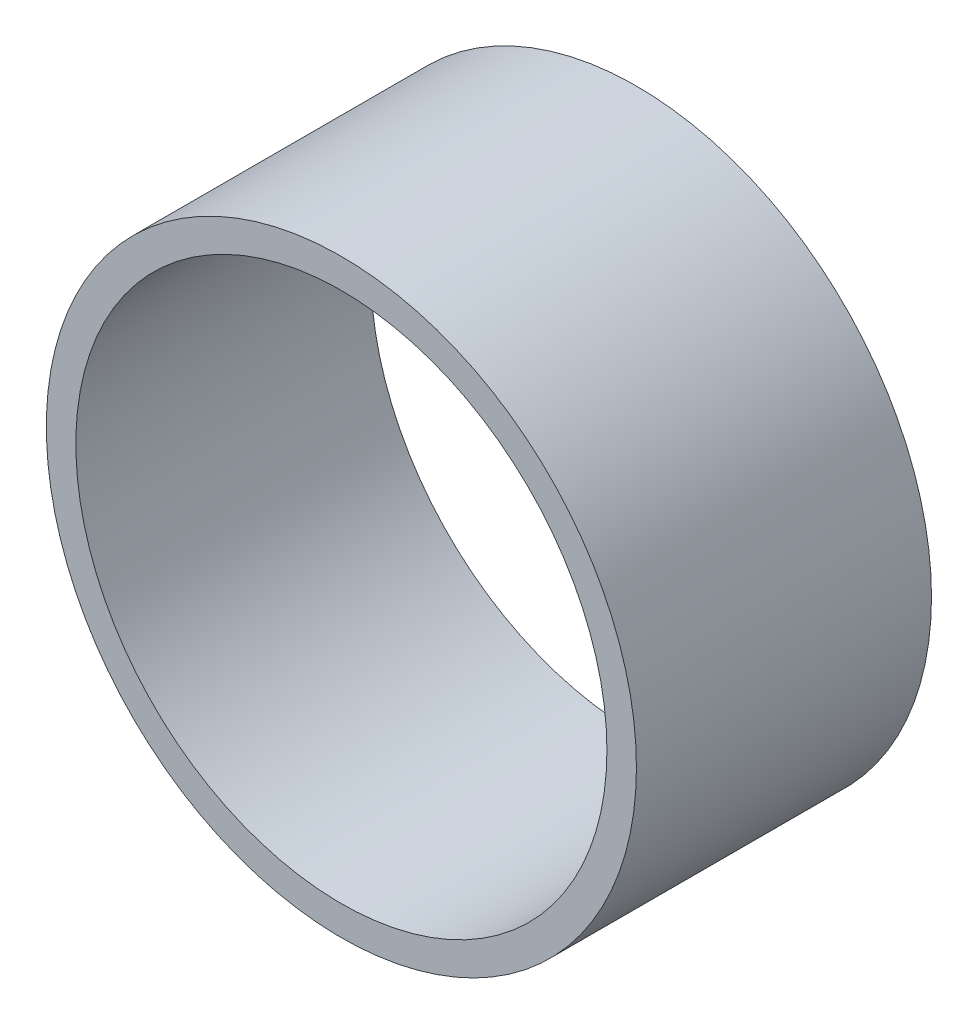
ISO-10303-21;
HEADER;
FILE_DESCRIPTION(('STEP AP214'),'2;1');
FILE_NAME('part.step','',(''),(''),'','','');
FILE_SCHEMA(('AUTOMOTIVE_DESIGN { 1 0 10303 214 1 1 1 1 }'));
ENDSEC;
DATA;
#1=APPLICATION_CONTEXT('core data for automotive mechanical design processes');
#2=APPLICATION_PROTOCOL_DEFINITION('international standard','automotive_design',2000,#1);
#3=PRODUCT_CONTEXT('',#1,'mechanical');
#4=PRODUCT('Part','Part','',(#3));
#5=PRODUCT_RELATED_PRODUCT_CATEGORY('part','',(#4));
#6=PRODUCT_DEFINITION_FORMATION('','',#4);
#7=PRODUCT_DEFINITION_CONTEXT('part definition',#1,'design');
#8=PRODUCT_DEFINITION('design','',#6,#7);
#9=PRODUCT_DEFINITION_SHAPE('','',#8);
#10=(LENGTH_UNIT() NAMED_UNIT(*) SI_UNIT(.MILLI.,.METRE.));
#11=(NAMED_UNIT(*) PLANE_ANGLE_UNIT() SI_UNIT($,.RADIAN.));
#12=(NAMED_UNIT(*) SI_UNIT($,.STERADIAN.) SOLID_ANGLE_UNIT());
#13=UNCERTAINTY_MEASURE_WITH_UNIT(LENGTH_MEASURE(1.E-05),#10,'distance_accuracy_value','');
#14=(GEOMETRIC_REPRESENTATION_CONTEXT(3) GLOBAL_UNCERTAINTY_ASSIGNED_CONTEXT((#13)) GLOBAL_UNIT_ASSIGNED_CONTEXT((#10,
#11,#12)) REPRESENTATION_CONTEXT('',''));
#15=CARTESIAN_POINT('',(0.,0.,0.));
#16=DIRECTION('',(0.,0.,1.));
#17=DIRECTION('',(1.,0.,0.));
#18=AXIS2_PLACEMENT_3D('',#15,#16,#17);
#19=CARTESIAN_POINT('',(0.,0.,50.));
#20=DIRECTION('',(0.,0.,1.));
#21=DIRECTION('',(1.,0.,0.));
#22=AXIS2_PLACEMENT_3D('',#19,#20,#21);
#23=PLANE('',#22);
#24=CARTESIAN_POINT('',(0.,0.,50.));
#25=DIRECTION('',(0.,0.,1.));
#26=DIRECTION('',(1.,0.,0.));
#27=AXIS2_PLACEMENT_3D('',#24,#25,#26);
#28=CIRCLE('',#27,50.);
#29=CARTESIAN_POINT('',(50.,0.,50.));
#30=VERTEX_POINT('',#29);
#31=EDGE_CURVE('E10',#30,#30,#28,.T.);
#32=ORIENTED_EDGE('',*,*,#31,.T.);
#33=EDGE_LOOP('',(#32));
#34=FACE_BOUND('',#33,.T.);
#35=CARTESIAN_POINT('',(0.,0.,50.));
#36=DIRECTION('',(0.,0.,1.));
#37=DIRECTION('',(1.,0.,0.));
#38=AXIS2_PLACEMENT_3D('',#35,#36,#37);
#39=CIRCLE('',#38,45.);
#40=CARTESIAN_POINT('',(45.,0.,50.));
#41=VERTEX_POINT('',#40);
#42=EDGE_CURVE('E45',#41,#41,#39,.T.);
#43=ORIENTED_EDGE('',*,*,#42,.F.);
#44=EDGE_LOOP('',(#43));
#45=FACE_BOUND('',#44,.T.);
#46=ADVANCED_FACE('F34',(#34,#45),#23,.T.);
#47=CARTESIAN_POINT('',(0.,0.,0.));
#48=DIRECTION('',(0.,0.,1.));
#49=DIRECTION('',(1.,0.,0.));
#50=AXIS2_PLACEMENT_3D('',#47,#48,#49);
#51=PLANE('',#50);
#52=CARTESIAN_POINT('',(0.,0.,0.));
#53=DIRECTION('',(0.,0.,1.));
#54=DIRECTION('',(1.,0.,0.));
#55=AXIS2_PLACEMENT_3D('',#52,#53,#54);
#56=CIRCLE('',#55,50.);
#57=CARTESIAN_POINT('',(50.,0.,0.));
#58=VERTEX_POINT('',#57);
#59=EDGE_CURVE('E38',#58,#58,#56,.T.);
#60=ORIENTED_EDGE('',*,*,#59,.F.);
#61=EDGE_LOOP('',(#60));
#62=FACE_BOUND('',#61,.T.);
#63=CARTESIAN_POINT('',(0.,0.,0.));
#64=DIRECTION('',(0.,0.,1.));
#65=DIRECTION('',(1.,0.,0.));
#66=AXIS2_PLACEMENT_3D('',#63,#64,#65);
#67=CIRCLE('',#66,45.);
#68=CARTESIAN_POINT('',(45.,0.,0.));
#69=VERTEX_POINT('',#68);
#70=EDGE_CURVE('E47',#69,#69,#67,.T.);
#71=ORIENTED_EDGE('',*,*,#70,.T.);
#72=EDGE_LOOP('',(#71));
#73=FACE_BOUND('',#72,.T.);
#74=ADVANCED_FACE('F57',(#62,#73),#51,.F.);
#75=CARTESIAN_POINT('',(0.,0.,50.));
#76=DIRECTION('',(0.,0.,-1.));
#77=DIRECTION('',(-1.,0.,0.));
#78=AXIS2_PLACEMENT_3D('',#75,#76,#77);
#79=CYLINDRICAL_SURFACE('',#78,50.);
#80=ORIENTED_EDGE('',*,*,#31,.F.);
#81=EDGE_LOOP('',(#80));
#82=FACE_BOUND('',#81,.T.);
#83=ORIENTED_EDGE('',*,*,#59,.T.);
#84=EDGE_LOOP('',(#83));
#85=FACE_BOUND('',#84,.T.);
#86=ADVANCED_FACE('F36',(#82,#85),#79,.T.);
#87=CARTESIAN_POINT('',(0.,0.,50.));
#88=DIRECTION('',(0.,0.,-1.));
#89=DIRECTION('',(-1.,0.,0.));
#90=AXIS2_PLACEMENT_3D('',#87,#88,#89);
#91=CYLINDRICAL_SURFACE('',#90,45.);
#92=ORIENTED_EDGE('',*,*,#42,.T.);
#93=EDGE_LOOP('',(#92));
#94=FACE_BOUND('',#93,.T.);
#95=ORIENTED_EDGE('',*,*,#70,.F.);
#96=EDGE_LOOP('',(#95));
#97=FACE_BOUND('',#96,.T.);
#98=ADVANCED_FACE('F53',(#94,#97),#91,.F.);
#99=CLOSED_SHELL('',(#46,#74,#86,#98));
#100=MANIFOLD_SOLID_BREP('B2',#99);
#101=ADVANCED_BREP_SHAPE_REPRESENTATION('',(#18,#100),#14);
#102=SHAPE_DEFINITION_REPRESENTATION(#9,#101);
ENDSEC;
END-ISO-10303-21;
